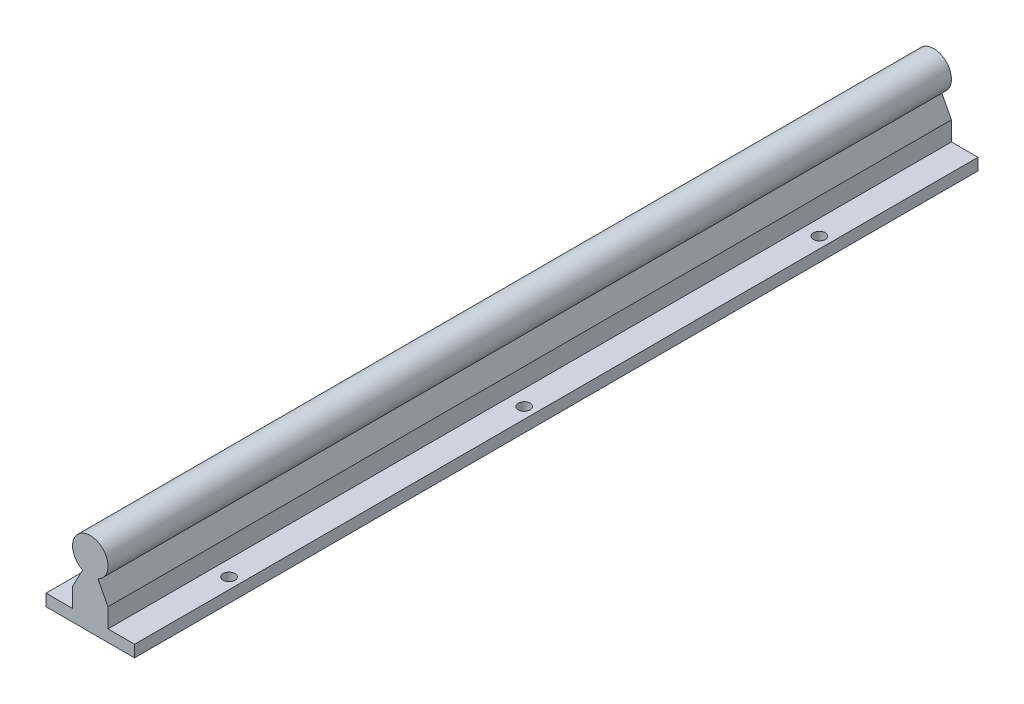
ISO-10303-21;
HEADER;
FILE_DESCRIPTION(('STEP AP214'),'2;1');
FILE_NAME('part.step','',(''),(''),'','','');
FILE_SCHEMA(('AUTOMOTIVE_DESIGN { 1 0 10303 214 1 1 1 1 }'));
ENDSEC;
DATA;
#1=APPLICATION_CONTEXT('core data for automotive mechanical design processes');
#2=APPLICATION_PROTOCOL_DEFINITION('international standard','automotive_design',2000,#1);
#3=PRODUCT_CONTEXT('',#1,'mechanical');
#4=PRODUCT('Part','Part','',(#3));
#5=PRODUCT_RELATED_PRODUCT_CATEGORY('part','',(#4));
#6=PRODUCT_DEFINITION_FORMATION('','',#4);
#7=PRODUCT_DEFINITION_CONTEXT('part definition',#1,'design');
#8=PRODUCT_DEFINITION('design','',#6,#7);
#9=PRODUCT_DEFINITION_SHAPE('','',#8);
#10=(LENGTH_UNIT() NAMED_UNIT(*) SI_UNIT(.MILLI.,.METRE.));
#11=(NAMED_UNIT(*) PLANE_ANGLE_UNIT() SI_UNIT($,.RADIAN.));
#12=(NAMED_UNIT(*) SI_UNIT($,.STERADIAN.) SOLID_ANGLE_UNIT());
#13=UNCERTAINTY_MEASURE_WITH_UNIT(LENGTH_MEASURE(1.E-05),#10,'distance_accuracy_value','');
#14=(GEOMETRIC_REPRESENTATION_CONTEXT(3) GLOBAL_UNCERTAINTY_ASSIGNED_CONTEXT((#13)) GLOBAL_UNIT_ASSIGNED_CONTEXT((#10,
#11,#12)) REPRESENTATION_CONTEXT('',''));
#15=CARTESIAN_POINT('',(0.,0.,0.));
#16=DIRECTION('',(0.,0.,1.));
#17=DIRECTION('',(1.,0.,0.));
#18=AXIS2_PLACEMENT_3D('',#15,#16,#17);
#19=CARTESIAN_POINT('',(19.7074577548358,0.,285.75));
#20=DIRECTION('',(-1.,0.,0.));
#21=DIRECTION('',(0.,-1.,0.));
#22=AXIS2_PLACEMENT_3D('',#19,#20,#21);
#23=PLANE('',#22);
#24=DIRECTION('',(0.,1.,0.));
#25=VECTOR('',#24,1.);
#26=CARTESIAN_POINT('',(19.7074577548358,0.,0.));
#27=LINE('',#26,#25);
#28=CARTESIAN_POINT('',(19.7074577548358,0.,0.));
#29=VERTEX_POINT('',#28);
#30=CARTESIAN_POINT('',(19.7074577548358,4.,0.));
#31=VERTEX_POINT('',#30);
#32=EDGE_CURVE('E141',#29,#31,#27,.T.);
#33=ORIENTED_EDGE('',*,*,#32,.T.);
#34=DIRECTION('',(0.,0.,-1.));
#35=VECTOR('',#34,1.);
#36=CARTESIAN_POINT('',(19.7074577548358,4.,285.75));
#37=LINE('',#36,#35);
#38=CARTESIAN_POINT('',(19.7074577548358,4.,285.75));
#39=VERTEX_POINT('',#38);
#40=EDGE_CURVE('E11',#39,#31,#37,.T.);
#41=ORIENTED_EDGE('',*,*,#40,.F.);
#42=DIRECTION('',(0.,1.,0.));
#43=VECTOR('',#42,1.);
#44=CARTESIAN_POINT('',(19.7074577548358,0.,285.75));
#45=LINE('',#44,#43);
#46=CARTESIAN_POINT('',(19.7074577548358,0.,285.75));
#47=VERTEX_POINT('',#46);
#48=EDGE_CURVE('E160',#47,#39,#45,.T.);
#49=ORIENTED_EDGE('',*,*,#48,.F.);
#50=DIRECTION('',(0.,0.,-1.));
#51=VECTOR('',#50,1.);
#52=CARTESIAN_POINT('',(19.7074577548358,0.,285.75));
#53=LINE('',#52,#51);
#54=EDGE_CURVE('E137',#47,#29,#53,.T.);
#55=ORIENTED_EDGE('',*,*,#54,.T.);
#56=EDGE_LOOP('',(#33,#41,#49,#55));
#57=FACE_BOUND('',#56,.T.);
#58=ADVANCED_FACE('F33',(#57),#23,.F.);
#59=CARTESIAN_POINT('',(19.7074577548358,4.,285.75));
#60=DIRECTION('',(0.,-1.,0.));
#61=DIRECTION('',(0.,0.,-1.));
#62=AXIS2_PLACEMENT_3D('',#59,#60,#61);
#63=PLANE('',#62);
#64=CARTESIAN_POINT('',(15.9574577548358,4.,250.));
#65=DIRECTION('',(0.,1.,0.));
#66=DIRECTION('',(0.,0.,1.));
#67=AXIS2_PLACEMENT_3D('',#64,#65,#66);
#68=CIRCLE('',#67,2.);
#69=CARTESIAN_POINT('',(15.9574577548358,4.,252.));
#70=VERTEX_POINT('',#69);
#71=EDGE_CURVE('E239',#70,#70,#68,.T.);
#72=ORIENTED_EDGE('',*,*,#71,.F.);
#73=EDGE_LOOP('',(#72));
#74=FACE_BOUND('',#73,.T.);
#75=CARTESIAN_POINT('',(15.9574577548358,4.,150.));
#76=DIRECTION('',(0.,1.,0.));
#77=DIRECTION('',(0.,0.,1.));
#78=AXIS2_PLACEMENT_3D('',#75,#76,#77);
#79=CIRCLE('',#78,2.);
#80=CARTESIAN_POINT('',(15.9574577548358,4.,152.));
#81=VERTEX_POINT('',#80);
#82=EDGE_CURVE('E227',#81,#81,#79,.T.);
#83=ORIENTED_EDGE('',*,*,#82,.F.);
#84=EDGE_LOOP('',(#83));
#85=FACE_BOUND('',#84,.T.);
#86=CARTESIAN_POINT('',(15.9574577548358,4.,50.));
#87=DIRECTION('',(0.,1.,0.));
#88=DIRECTION('',(0.,0.,1.));
#89=AXIS2_PLACEMENT_3D('',#86,#87,#88);
#90=CIRCLE('',#89,2.);
#91=CARTESIAN_POINT('',(15.9574577548358,4.,52.));
#92=VERTEX_POINT('',#91);
#93=EDGE_CURVE('E215',#92,#92,#90,.T.);
#94=ORIENTED_EDGE('',*,*,#93,.F.);
#95=EDGE_LOOP('',(#94));
#96=FACE_BOUND('',#95,.T.);
#97=DIRECTION('',(-1.,0.,0.));
#98=VECTOR('',#97,1.);
#99=CARTESIAN_POINT('',(19.7074577548358,4.,0.));
#100=LINE('',#99,#98);
#101=CARTESIAN_POINT('',(10.7074577548358,4.,0.));
#102=VERTEX_POINT('',#101);
#103=EDGE_CURVE('E144',#31,#102,#100,.T.);
#104=ORIENTED_EDGE('',*,*,#103,.T.);
#105=DIRECTION('',(0.,0.,-1.));
#106=VECTOR('',#105,1.);
#107=CARTESIAN_POINT('',(10.7074577548358,4.,285.75));
#108=LINE('',#107,#106);
#109=CARTESIAN_POINT('',(10.7074577548358,4.,285.75));
#110=VERTEX_POINT('',#109);
#111=EDGE_CURVE('E41',#110,#102,#108,.T.);
#112=ORIENTED_EDGE('',*,*,#111,.F.);
#113=DIRECTION('',(-1.,0.,0.));
#114=VECTOR('',#113,1.);
#115=CARTESIAN_POINT('',(19.7074577548358,4.,285.75));
#116=LINE('',#115,#114);
#117=EDGE_CURVE('E98',#39,#110,#116,.T.);
#118=ORIENTED_EDGE('',*,*,#117,.F.);
#119=ORIENTED_EDGE('',*,*,#40,.T.);
#120=EDGE_LOOP('',(#104,#112,#118,#119));
#121=FACE_BOUND('',#120,.T.);
#122=ADVANCED_FACE('F246',(#74,#85,#96,#121),#63,.F.);
#123=CARTESIAN_POINT('',(10.7074577548358,4.,285.75));
#124=DIRECTION('',(-1.,0.,0.));
#125=DIRECTION('',(0.,0.,1.));
#126=AXIS2_PLACEMENT_3D('',#123,#124,#125);
#127=PLANE('',#126);
#128=DIRECTION('',(0.,1.,0.));
#129=VECTOR('',#128,1.);
#130=CARTESIAN_POINT('',(10.7074577548358,4.,0.));
#131=LINE('',#130,#129);
#132=CARTESIAN_POINT('',(10.7074577548358,10.5,0.));
#133=VERTEX_POINT('',#132);
#134=EDGE_CURVE('E147',#102,#133,#131,.T.);
#135=ORIENTED_EDGE('',*,*,#134,.T.);
#136=DIRECTION('',(0.,0.,-1.));
#137=VECTOR('',#136,1.);
#138=CARTESIAN_POINT('',(10.7074577548358,10.5,285.75));
#139=LINE('',#138,#137);
#140=CARTESIAN_POINT('',(10.7074577548358,10.5,285.75));
#141=VERTEX_POINT('',#140);
#142=EDGE_CURVE('E173',#141,#133,#139,.T.);
#143=ORIENTED_EDGE('',*,*,#142,.F.);
#144=DIRECTION('',(0.,1.,0.));
#145=VECTOR('',#144,1.);
#146=CARTESIAN_POINT('',(10.7074577548358,4.,285.75));
#147=LINE('',#146,#145);
#148=EDGE_CURVE('E181',#110,#141,#147,.T.);
#149=ORIENTED_EDGE('',*,*,#148,.F.);
#150=ORIENTED_EDGE('',*,*,#111,.T.);
#151=EDGE_LOOP('',(#135,#143,#149,#150));
#152=FACE_BOUND('',#151,.T.);
#153=ADVANCED_FACE('F179',(#152),#127,.F.);
#154=CARTESIAN_POINT('',(7.30745775483578,17.,285.75));
#155=DIRECTION('',(-0.88609821280882,-0.463497526699998,0.));
#156=DIRECTION('',(0.463497526699998,-0.88609821280882,0.));
#157=AXIS2_PLACEMENT_3D('',#154,#155,#156);
#158=PLANE('',#157);
#159=DIRECTION('',(-0.463497526699998,0.88609821280882,0.));
#160=VECTOR('',#159,1.);
#161=CARTESIAN_POINT('',(7.30745775483578,17.,0.));
#162=LINE('',#161,#160);
#163=CARTESIAN_POINT('',(7.30745775483578,17.,0.));
#164=VERTEX_POINT('',#163);
#165=EDGE_CURVE('E149',#133,#164,#162,.T.);
#166=ORIENTED_EDGE('',*,*,#165,.T.);
#167=DIRECTION('',(0.,0.,-1.));
#168=VECTOR('',#167,1.);
#169=CARTESIAN_POINT('',(7.30745775483578,17.,285.75));
#170=LINE('',#169,#168);
#171=CARTESIAN_POINT('',(7.30745775483578,17.,285.75));
#172=VERTEX_POINT('',#171);
#173=EDGE_CURVE('E170',#172,#164,#170,.T.);
#174=ORIENTED_EDGE('',*,*,#173,.F.);
#175=DIRECTION('',(-0.463497526699998,0.88609821280882,0.));
#176=VECTOR('',#175,1.);
#177=CARTESIAN_POINT('',(7.30745775483578,17.,285.75));
#178=LINE('',#177,#176);
#179=EDGE_CURVE('E199',#141,#172,#178,.T.);
#180=ORIENTED_EDGE('',*,*,#179,.F.);
#181=ORIENTED_EDGE('',*,*,#142,.T.);
#182=EDGE_LOOP('',(#166,#174,#180,#181));
#183=FACE_BOUND('',#182,.T.);
#184=ADVANCED_FACE('F190',(#183),#158,.F.);
#185=CARTESIAN_POINT('',(4.70745775483578,22.4074023338383,285.75));
#186=DIRECTION('',(0.,0.,-1.));
#187=DIRECTION('',(-1.,0.,0.));
#188=AXIS2_PLACEMENT_3D('',#185,#186,#187);
#189=CYLINDRICAL_SURFACE('',#188,6.);
#190=CARTESIAN_POINT('',(4.70745775483578,22.4074023338383,0.));
#191=DIRECTION('',(0.,0.,1.));
#192=DIRECTION('',(1.,0.,0.));
#193=AXIS2_PLACEMENT_3D('',#190,#191,#192);
#194=CIRCLE('',#193,6.);
#195=CARTESIAN_POINT('',(2.10745775483578,17.,0.));
#196=VERTEX_POINT('',#195);
#197=EDGE_CURVE('E151',#164,#196,#194,.T.);
#198=ORIENTED_EDGE('',*,*,#197,.T.);
#199=DIRECTION('',(0.,0.,-1.));
#200=VECTOR('',#199,1.);
#201=CARTESIAN_POINT('',(2.10745775483578,17.,285.75));
#202=LINE('',#201,#200);
#203=CARTESIAN_POINT('',(2.10745775483578,17.,285.75));
#204=VERTEX_POINT('',#203);
#205=EDGE_CURVE('E167',#204,#196,#202,.T.);
#206=ORIENTED_EDGE('',*,*,#205,.F.);
#207=CARTESIAN_POINT('',(4.70745775483578,22.4074023338383,285.75));
#208=DIRECTION('',(0.,0.,1.));
#209=DIRECTION('',(1.,0.,0.));
#210=AXIS2_PLACEMENT_3D('',#207,#208,#209);
#211=CIRCLE('',#210,6.);
#212=EDGE_CURVE('E196',#172,#204,#211,.T.);
#213=ORIENTED_EDGE('',*,*,#212,.F.);
#214=ORIENTED_EDGE('',*,*,#173,.T.);
#215=EDGE_LOOP('',(#198,#206,#213,#214));
#216=FACE_BOUND('',#215,.T.);
#217=ADVANCED_FACE('F194',(#216),#189,.T.);
#218=CARTESIAN_POINT('',(-1.29254224516422,10.5,285.75));
#219=DIRECTION('',(0.88609821280882,-0.463497526699998,0.));
#220=DIRECTION('',(0.463497526699998,0.88609821280882,0.));
#221=AXIS2_PLACEMENT_3D('',#218,#219,#220);
#222=PLANE('',#221);
#223=DIRECTION('',(-0.463497526699998,-0.88609821280882,0.));
#224=VECTOR('',#223,1.);
#225=CARTESIAN_POINT('',(-1.29254224516422,10.5,0.));
#226=LINE('',#225,#224);
#227=CARTESIAN_POINT('',(-1.29254224516422,10.5,0.));
#228=VERTEX_POINT('',#227);
#229=EDGE_CURVE('E153',#196,#228,#226,.T.);
#230=ORIENTED_EDGE('',*,*,#229,.T.);
#231=DIRECTION('',(0.,0.,-1.));
#232=VECTOR('',#231,1.);
#233=CARTESIAN_POINT('',(-1.29254224516422,10.5,285.75));
#234=LINE('',#233,#232);
#235=CARTESIAN_POINT('',(-1.29254224516422,10.5,285.75));
#236=VERTEX_POINT('',#235);
#237=EDGE_CURVE('E164',#236,#228,#234,.T.);
#238=ORIENTED_EDGE('',*,*,#237,.F.);
#239=DIRECTION('',(-0.463497526699998,-0.88609821280882,0.));
#240=VECTOR('',#239,1.);
#241=CARTESIAN_POINT('',(-1.29254224516422,10.5,285.75));
#242=LINE('',#241,#240);
#243=EDGE_CURVE('E198',#204,#236,#242,.T.);
#244=ORIENTED_EDGE('',*,*,#243,.F.);
#245=ORIENTED_EDGE('',*,*,#205,.T.);
#246=EDGE_LOOP('',(#230,#238,#244,#245));
#247=FACE_BOUND('',#246,.T.);
#248=ADVANCED_FACE('F260',(#247),#222,.F.);
#249=CARTESIAN_POINT('',(-1.29254224516422,4.,285.75));
#250=DIRECTION('',(1.,0.,0.));
#251=DIRECTION('',(0.,0.,-1.));
#252=AXIS2_PLACEMENT_3D('',#249,#250,#251);
#253=PLANE('',#252);
#254=DIRECTION('',(0.,-1.,0.));
#255=VECTOR('',#254,1.);
#256=CARTESIAN_POINT('',(-1.29254224516422,4.,0.));
#257=LINE('',#256,#255);
#258=CARTESIAN_POINT('',(-1.29254224516422,4.,0.));
#259=VERTEX_POINT('',#258);
#260=EDGE_CURVE('E155',#228,#259,#257,.T.);
#261=ORIENTED_EDGE('',*,*,#260,.T.);
#262=DIRECTION('',(0.,0.,-1.));
#263=VECTOR('',#262,1.);
#264=CARTESIAN_POINT('',(-1.29254224516422,4.,285.75));
#265=LINE('',#264,#263);
#266=CARTESIAN_POINT('',(-1.29254224516422,4.,285.75));
#267=VERTEX_POINT('',#266);
#268=EDGE_CURVE('E132',#267,#259,#265,.T.);
#269=ORIENTED_EDGE('',*,*,#268,.F.);
#270=DIRECTION('',(0.,-1.,0.));
#271=VECTOR('',#270,1.);
#272=CARTESIAN_POINT('',(-1.29254224516422,4.,285.75));
#273=LINE('',#272,#271);
#274=EDGE_CURVE('E123',#236,#267,#273,.T.);
#275=ORIENTED_EDGE('',*,*,#274,.F.);
#276=ORIENTED_EDGE('',*,*,#237,.T.);
#277=EDGE_LOOP('',(#261,#269,#275,#276));
#278=FACE_BOUND('',#277,.T.);
#279=ADVANCED_FACE('F257',(#278),#253,.F.);
#280=CARTESIAN_POINT('',(-10.2925422451642,4.,285.75));
#281=DIRECTION('',(0.,-1.,0.));
#282=DIRECTION('',(0.,0.,-1.));
#283=AXIS2_PLACEMENT_3D('',#280,#281,#282);
#284=PLANE('',#283);
#285=CARTESIAN_POINT('',(-6.54254224516422,4.,250.));
#286=DIRECTION('',(0.,1.,0.));
#287=DIRECTION('',(0.,0.,1.));
#288=AXIS2_PLACEMENT_3D('',#285,#286,#287);
#289=CIRCLE('',#288,2.);
#290=CARTESIAN_POINT('',(-6.54254224516422,4.,252.));
#291=VERTEX_POINT('',#290);
#292=EDGE_CURVE('E233',#291,#291,#289,.T.);
#293=ORIENTED_EDGE('',*,*,#292,.F.);
#294=EDGE_LOOP('',(#293));
#295=FACE_BOUND('',#294,.T.);
#296=CARTESIAN_POINT('',(-6.54254224516422,4.,150.));
#297=DIRECTION('',(0.,1.,0.));
#298=DIRECTION('',(0.,0.,1.));
#299=AXIS2_PLACEMENT_3D('',#296,#297,#298);
#300=CIRCLE('',#299,2.);
#301=CARTESIAN_POINT('',(-6.54254224516422,4.,152.));
#302=VERTEX_POINT('',#301);
#303=EDGE_CURVE('E221',#302,#302,#300,.T.);
#304=ORIENTED_EDGE('',*,*,#303,.F.);
#305=EDGE_LOOP('',(#304));
#306=FACE_BOUND('',#305,.T.);
#307=CARTESIAN_POINT('',(-6.54254224516422,4.,50.));
#308=DIRECTION('',(0.,1.,0.));
#309=DIRECTION('',(0.,0.,1.));
#310=AXIS2_PLACEMENT_3D('',#307,#308,#309);
#311=CIRCLE('',#310,2.);
#312=CARTESIAN_POINT('',(-6.54254224516422,4.,52.));
#313=VERTEX_POINT('',#312);
#314=EDGE_CURVE('E209',#313,#313,#311,.T.);
#315=ORIENTED_EDGE('',*,*,#314,.F.);
#316=EDGE_LOOP('',(#315));
#317=FACE_BOUND('',#316,.T.);
#318=DIRECTION('',(-1.,0.,0.));
#319=VECTOR('',#318,1.);
#320=CARTESIAN_POINT('',(-10.2925422451642,4.,0.));
#321=LINE('',#320,#319);
#322=CARTESIAN_POINT('',(-10.2925422451642,4.,0.));
#323=VERTEX_POINT('',#322);
#324=EDGE_CURVE('E131',#259,#323,#321,.T.);
#325=ORIENTED_EDGE('',*,*,#324,.T.);
#326=DIRECTION('',(0.,0.,-1.));
#327=VECTOR('',#326,1.);
#328=CARTESIAN_POINT('',(-10.2925422451642,4.,285.75));
#329=LINE('',#328,#327);
#330=CARTESIAN_POINT('',(-10.2925422451642,4.,285.75));
#331=VERTEX_POINT('',#330);
#332=EDGE_CURVE('E128',#331,#323,#329,.T.);
#333=ORIENTED_EDGE('',*,*,#332,.F.);
#334=DIRECTION('',(-1.,0.,0.));
#335=VECTOR('',#334,1.);
#336=CARTESIAN_POINT('',(-10.2925422451642,4.,285.75));
#337=LINE('',#336,#335);
#338=EDGE_CURVE('E117',#267,#331,#337,.T.);
#339=ORIENTED_EDGE('',*,*,#338,.F.);
#340=ORIENTED_EDGE('',*,*,#268,.T.);
#341=EDGE_LOOP('',(#325,#333,#339,#340));
#342=FACE_BOUND('',#341,.T.);
#343=ADVANCED_FACE('F129',(#295,#306,#317,#342),#284,.F.);
#344=CARTESIAN_POINT('',(-10.2925422451642,0.,285.75));
#345=DIRECTION('',(1.,0.,0.));
#346=DIRECTION('',(0.,1.,0.));
#347=AXIS2_PLACEMENT_3D('',#344,#345,#346);
#348=PLANE('',#347);
#349=DIRECTION('',(0.,-1.,0.));
#350=VECTOR('',#349,1.);
#351=CARTESIAN_POINT('',(-10.2925422451642,0.,0.));
#352=LINE('',#351,#350);
#353=CARTESIAN_POINT('',(-10.2925422451642,0.,0.));
#354=VERTEX_POINT('',#353);
#355=EDGE_CURVE('E84',#323,#354,#352,.T.);
#356=ORIENTED_EDGE('',*,*,#355,.T.);
#357=DIRECTION('',(0.,0.,-1.));
#358=VECTOR('',#357,1.);
#359=CARTESIAN_POINT('',(-10.2925422451642,0.,285.75));
#360=LINE('',#359,#358);
#361=CARTESIAN_POINT('',(-10.2925422451642,0.,285.75));
#362=VERTEX_POINT('',#361);
#363=EDGE_CURVE('E133',#362,#354,#360,.T.);
#364=ORIENTED_EDGE('',*,*,#363,.F.);
#365=DIRECTION('',(0.,-1.,0.));
#366=VECTOR('',#365,1.);
#367=CARTESIAN_POINT('',(-10.2925422451642,0.,285.75));
#368=LINE('',#367,#366);
#369=EDGE_CURVE('E121',#331,#362,#368,.T.);
#370=ORIENTED_EDGE('',*,*,#369,.F.);
#371=ORIENTED_EDGE('',*,*,#332,.T.);
#372=EDGE_LOOP('',(#356,#364,#370,#371));
#373=FACE_BOUND('',#372,.T.);
#374=ADVANCED_FACE('F135',(#373),#348,.F.);
#375=CARTESIAN_POINT('',(19.7074577548358,0.,285.75));
#376=DIRECTION('',(0.,1.,0.));
#377=DIRECTION('',(0.,0.,1.));
#378=AXIS2_PLACEMENT_3D('',#375,#376,#377);
#379=PLANE('',#378);
#380=CARTESIAN_POINT('',(15.9574577548358,0.,250.));
#381=DIRECTION('',(0.,1.,0.));
#382=DIRECTION('',(0.,0.,1.));
#383=AXIS2_PLACEMENT_3D('',#380,#381,#382);
#384=CIRCLE('',#383,2.);
#385=CARTESIAN_POINT('',(15.9574577548358,0.,252.));
#386=VERTEX_POINT('',#385);
#387=EDGE_CURVE('E236',#386,#386,#384,.F.);
#388=ORIENTED_EDGE('',*,*,#387,.F.);
#389=EDGE_LOOP('',(#388));
#390=FACE_BOUND('',#389,.T.);
#391=CARTESIAN_POINT('',(-6.54254224516422,0.,250.));
#392=DIRECTION('',(0.,1.,0.));
#393=DIRECTION('',(0.,0.,1.));
#394=AXIS2_PLACEMENT_3D('',#391,#392,#393);
#395=CIRCLE('',#394,2.);
#396=CARTESIAN_POINT('',(-6.54254224516422,0.,252.));
#397=VERTEX_POINT('',#396);
#398=EDGE_CURVE('E230',#397,#397,#395,.F.);
#399=ORIENTED_EDGE('',*,*,#398,.F.);
#400=EDGE_LOOP('',(#399));
#401=FACE_BOUND('',#400,.T.);
#402=CARTESIAN_POINT('',(15.9574577548358,0.,150.));
#403=DIRECTION('',(0.,1.,0.));
#404=DIRECTION('',(0.,0.,1.));
#405=AXIS2_PLACEMENT_3D('',#402,#403,#404);
#406=CIRCLE('',#405,2.);
#407=CARTESIAN_POINT('',(15.9574577548358,0.,152.));
#408=VERTEX_POINT('',#407);
#409=EDGE_CURVE('E224',#408,#408,#406,.F.);
#410=ORIENTED_EDGE('',*,*,#409,.F.);
#411=EDGE_LOOP('',(#410));
#412=FACE_BOUND('',#411,.T.);
#413=CARTESIAN_POINT('',(-6.54254224516422,0.,150.));
#414=DIRECTION('',(0.,1.,0.));
#415=DIRECTION('',(0.,0.,1.));
#416=AXIS2_PLACEMENT_3D('',#413,#414,#415);
#417=CIRCLE('',#416,2.);
#418=CARTESIAN_POINT('',(-6.54254224516422,0.,152.));
#419=VERTEX_POINT('',#418);
#420=EDGE_CURVE('E218',#419,#419,#417,.F.);
#421=ORIENTED_EDGE('',*,*,#420,.F.);
#422=EDGE_LOOP('',(#421));
#423=FACE_BOUND('',#422,.T.);
#424=CARTESIAN_POINT('',(15.9574577548358,0.,50.));
#425=DIRECTION('',(0.,1.,0.));
#426=DIRECTION('',(0.,0.,1.));
#427=AXIS2_PLACEMENT_3D('',#424,#425,#426);
#428=CIRCLE('',#427,2.);
#429=CARTESIAN_POINT('',(15.9574577548358,0.,52.));
#430=VERTEX_POINT('',#429);
#431=EDGE_CURVE('E212',#430,#430,#428,.F.);
#432=ORIENTED_EDGE('',*,*,#431,.F.);
#433=EDGE_LOOP('',(#432));
#434=FACE_BOUND('',#433,.T.);
#435=CARTESIAN_POINT('',(-6.54254224516422,0.,50.));
#436=DIRECTION('',(0.,1.,0.));
#437=DIRECTION('',(0.,0.,1.));
#438=AXIS2_PLACEMENT_3D('',#435,#436,#437);
#439=CIRCLE('',#438,2.);
#440=CARTESIAN_POINT('',(-6.54254224516422,0.,52.));
#441=VERTEX_POINT('',#440);
#442=EDGE_CURVE('E145',#441,#441,#439,.F.);
#443=ORIENTED_EDGE('',*,*,#442,.F.);
#444=EDGE_LOOP('',(#443));
#445=FACE_BOUND('',#444,.T.);
#446=DIRECTION('',(1.,0.,0.));
#447=VECTOR('',#446,1.);
#448=CARTESIAN_POINT('',(19.7074577548358,0.,0.));
#449=LINE('',#448,#447);
#450=EDGE_CURVE('E90',#354,#29,#449,.T.);
#451=ORIENTED_EDGE('',*,*,#450,.T.);
#452=ORIENTED_EDGE('',*,*,#54,.F.);
#453=DIRECTION('',(1.,0.,0.));
#454=VECTOR('',#453,1.);
#455=CARTESIAN_POINT('',(19.7074577548358,0.,285.75));
#456=LINE('',#455,#454);
#457=EDGE_CURVE('E49',#362,#47,#456,.T.);
#458=ORIENTED_EDGE('',*,*,#457,.F.);
#459=ORIENTED_EDGE('',*,*,#363,.T.);
#460=EDGE_LOOP('',(#451,#452,#458,#459));
#461=FACE_BOUND('',#460,.T.);
#462=ADVANCED_FACE('F315',(#390,#401,#412,#423,#434,#445,#461),#379,.F.);
#463=CARTESIAN_POINT('',(4.70745775483578,22.4074023338383,285.75));
#464=DIRECTION('',(0.,0.,1.));
#465=DIRECTION('',(1.,0.,0.));
#466=AXIS2_PLACEMENT_3D('',#463,#464,#465);
#467=PLANE('',#466);
#468=ORIENTED_EDGE('',*,*,#48,.T.);
#469=ORIENTED_EDGE('',*,*,#117,.T.);
#470=ORIENTED_EDGE('',*,*,#148,.T.);
#471=ORIENTED_EDGE('',*,*,#179,.T.);
#472=ORIENTED_EDGE('',*,*,#212,.T.);
#473=ORIENTED_EDGE('',*,*,#243,.T.);
#474=ORIENTED_EDGE('',*,*,#274,.T.);
#475=ORIENTED_EDGE('',*,*,#338,.T.);
#476=ORIENTED_EDGE('',*,*,#369,.T.);
#477=ORIENTED_EDGE('',*,*,#457,.T.);
#478=EDGE_LOOP('',(#468,#469,#470,#471,#472,#473,#474,#475,#476,#477));
#479=FACE_BOUND('',#478,.T.);
#480=ADVANCED_FACE('F119',(#479),#467,.T.);
#481=CARTESIAN_POINT('',(4.70745775483578,22.4074023338383,0.));
#482=DIRECTION('',(0.,0.,1.));
#483=DIRECTION('',(1.,0.,0.));
#484=AXIS2_PLACEMENT_3D('',#481,#482,#483);
#485=PLANE('',#484);
#486=ORIENTED_EDGE('',*,*,#32,.F.);
#487=ORIENTED_EDGE('',*,*,#450,.F.);
#488=ORIENTED_EDGE('',*,*,#355,.F.);
#489=ORIENTED_EDGE('',*,*,#324,.F.);
#490=ORIENTED_EDGE('',*,*,#260,.F.);
#491=ORIENTED_EDGE('',*,*,#229,.F.);
#492=ORIENTED_EDGE('',*,*,#197,.F.);
#493=ORIENTED_EDGE('',*,*,#165,.F.);
#494=ORIENTED_EDGE('',*,*,#134,.F.);
#495=ORIENTED_EDGE('',*,*,#103,.F.);
#496=EDGE_LOOP('',(#486,#487,#488,#489,#490,#491,#492,#493,#494,#495));
#497=FACE_BOUND('',#496,.T.);
#498=ADVANCED_FACE('F185',(#497),#485,.F.);
#499=CARTESIAN_POINT('',(-6.54254224516422,-0.0010000000000036,50.));
#500=DIRECTION('',(0.,1.,0.));
#501=DIRECTION('',(0.,0.,1.));
#502=AXIS2_PLACEMENT_3D('',#499,#500,#501);
#503=CYLINDRICAL_SURFACE('',#502,2.);
#504=ORIENTED_EDGE('',*,*,#314,.T.);
#505=EDGE_LOOP('',(#504));
#506=FACE_BOUND('',#505,.T.);
#507=ORIENTED_EDGE('',*,*,#442,.T.);
#508=EDGE_LOOP('',(#507));
#509=FACE_BOUND('',#508,.T.);
#510=ADVANCED_FACE('F332',(#506,#509),#503,.F.);
#511=CARTESIAN_POINT('',(15.9574577548358,-0.0010000000000036,50.));
#512=DIRECTION('',(0.,1.,0.));
#513=DIRECTION('',(0.,0.,1.));
#514=AXIS2_PLACEMENT_3D('',#511,#512,#513);
#515=CYLINDRICAL_SURFACE('',#514,2.);
#516=ORIENTED_EDGE('',*,*,#93,.T.);
#517=EDGE_LOOP('',(#516));
#518=FACE_BOUND('',#517,.T.);
#519=ORIENTED_EDGE('',*,*,#431,.T.);
#520=EDGE_LOOP('',(#519));
#521=FACE_BOUND('',#520,.T.);
#522=ADVANCED_FACE('F342',(#518,#521),#515,.F.);
#523=CARTESIAN_POINT('',(-6.54254224516422,-0.0010000000000036,150.));
#524=DIRECTION('',(0.,1.,0.));
#525=DIRECTION('',(0.,0.,1.));
#526=AXIS2_PLACEMENT_3D('',#523,#524,#525);
#527=CYLINDRICAL_SURFACE('',#526,2.);
#528=ORIENTED_EDGE('',*,*,#303,.T.);
#529=EDGE_LOOP('',(#528));
#530=FACE_BOUND('',#529,.T.);
#531=ORIENTED_EDGE('',*,*,#420,.T.);
#532=EDGE_LOOP('',(#531));
#533=FACE_BOUND('',#532,.T.);
#534=ADVANCED_FACE('F350',(#530,#533),#527,.F.);
#535=CARTESIAN_POINT('',(15.9574577548358,-0.0010000000000036,150.));
#536=DIRECTION('',(0.,1.,0.));
#537=DIRECTION('',(0.,0.,1.));
#538=AXIS2_PLACEMENT_3D('',#535,#536,#537);
#539=CYLINDRICAL_SURFACE('',#538,2.);
#540=ORIENTED_EDGE('',*,*,#82,.T.);
#541=EDGE_LOOP('',(#540));
#542=FACE_BOUND('',#541,.T.);
#543=ORIENTED_EDGE('',*,*,#409,.T.);
#544=EDGE_LOOP('',(#543));
#545=FACE_BOUND('',#544,.T.);
#546=ADVANCED_FACE('F358',(#542,#545),#539,.F.);
#547=CARTESIAN_POINT('',(-6.54254224516422,-0.0010000000000036,250.));
#548=DIRECTION('',(0.,1.,0.));
#549=DIRECTION('',(0.,0.,1.));
#550=AXIS2_PLACEMENT_3D('',#547,#548,#549);
#551=CYLINDRICAL_SURFACE('',#550,2.);
#552=ORIENTED_EDGE('',*,*,#292,.T.);
#553=EDGE_LOOP('',(#552));
#554=FACE_BOUND('',#553,.T.);
#555=ORIENTED_EDGE('',*,*,#398,.T.);
#556=EDGE_LOOP('',(#555));
#557=FACE_BOUND('',#556,.T.);
#558=ADVANCED_FACE('F366',(#554,#557),#551,.F.);
#559=CARTESIAN_POINT('',(15.9574577548358,-0.0010000000000036,250.));
#560=DIRECTION('',(0.,1.,0.));
#561=DIRECTION('',(0.,0.,1.));
#562=AXIS2_PLACEMENT_3D('',#559,#560,#561);
#563=CYLINDRICAL_SURFACE('',#562,2.);
#564=ORIENTED_EDGE('',*,*,#71,.T.);
#565=EDGE_LOOP('',(#564));
#566=FACE_BOUND('',#565,.T.);
#567=ORIENTED_EDGE('',*,*,#387,.T.);
#568=EDGE_LOOP('',(#567));
#569=FACE_BOUND('',#568,.T.);
#570=ADVANCED_FACE('F243',(#566,#569),#563,.F.);
#571=CLOSED_SHELL('',(#58,#122,#153,#184,#217,#248,#279,#343,#374,#462,#480,#498,#510,#522,#534,
#546,#558,#570));
#572=MANIFOLD_SOLID_BREP('B2',#571);
#573=ADVANCED_BREP_SHAPE_REPRESENTATION('',(#18,#572),#14);
#574=SHAPE_DEFINITION_REPRESENTATION(#9,#573);
ENDSEC;
END-ISO-10303-21;
